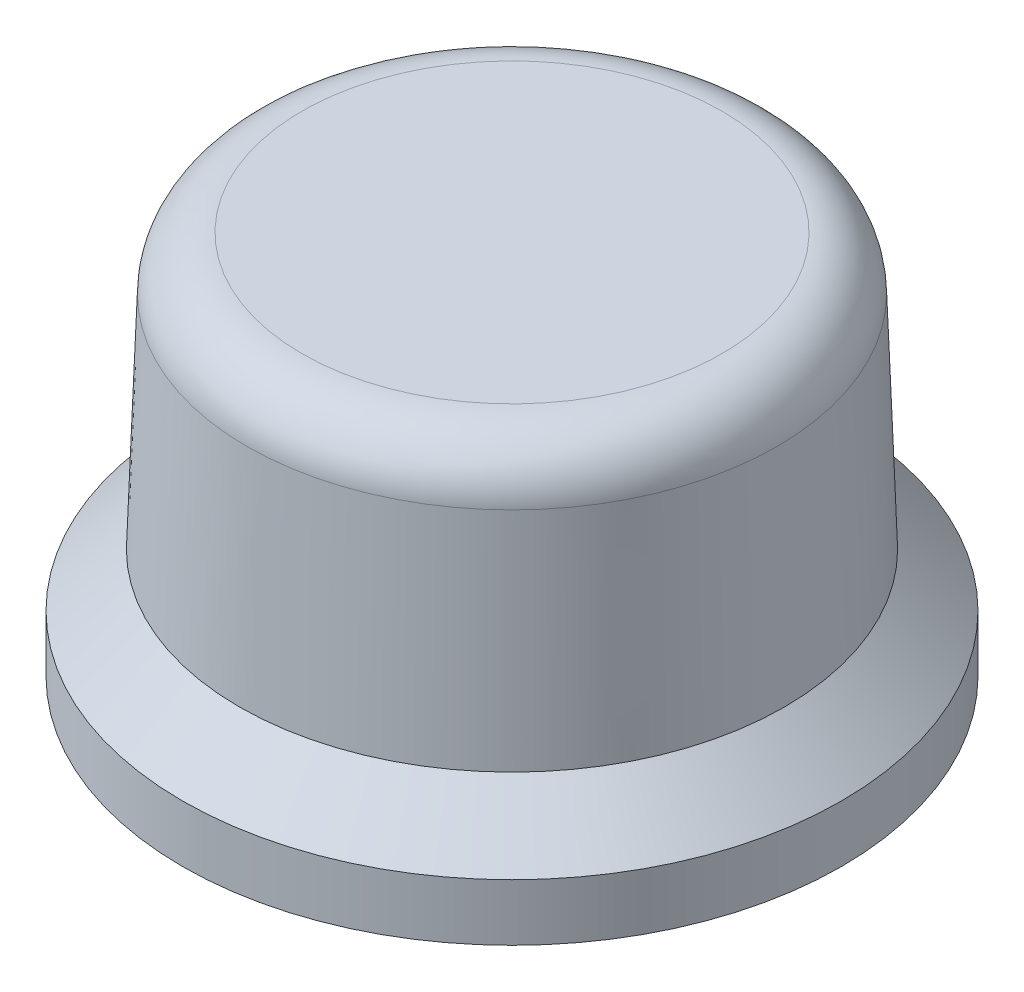
ISO-10303-21;
HEADER;
FILE_DESCRIPTION(('STEP AP214'),'2;1');
FILE_NAME('part.step','',(''),(''),'','','');
FILE_SCHEMA(('AUTOMOTIVE_DESIGN { 1 0 10303 214 1 1 1 1 }'));
ENDSEC;
DATA;
#1=APPLICATION_CONTEXT('core data for automotive mechanical design processes');
#2=APPLICATION_PROTOCOL_DEFINITION('international standard','automotive_design',2000,#1);
#3=PRODUCT_CONTEXT('',#1,'mechanical');
#4=PRODUCT('Part','Part','',(#3));
#5=PRODUCT_RELATED_PRODUCT_CATEGORY('part','',(#4));
#6=PRODUCT_DEFINITION_FORMATION('','',#4);
#7=PRODUCT_DEFINITION_CONTEXT('part definition',#1,'design');
#8=PRODUCT_DEFINITION('design','',#6,#7);
#9=PRODUCT_DEFINITION_SHAPE('','',#8);
#10=(LENGTH_UNIT() NAMED_UNIT(*) SI_UNIT(.MILLI.,.METRE.));
#11=(NAMED_UNIT(*) PLANE_ANGLE_UNIT() SI_UNIT($,.RADIAN.));
#12=(NAMED_UNIT(*) SI_UNIT($,.STERADIAN.) SOLID_ANGLE_UNIT());
#13=UNCERTAINTY_MEASURE_WITH_UNIT(LENGTH_MEASURE(1.E-05),#10,'distance_accuracy_value','');
#14=(GEOMETRIC_REPRESENTATION_CONTEXT(3) GLOBAL_UNCERTAINTY_ASSIGNED_CONTEXT((#13)) GLOBAL_UNIT_ASSIGNED_CONTEXT((#10,
#11,#12)) REPRESENTATION_CONTEXT('',''));
#15=CARTESIAN_POINT('',(0.,0.,0.));
#16=DIRECTION('',(0.,0.,1.));
#17=DIRECTION('',(1.,0.,0.));
#18=AXIS2_PLACEMENT_3D('',#15,#16,#17);
#19=CARTESIAN_POINT('',(0.,0.,0.));
#20=DIRECTION('',(0.,-1.,0.));
#21=DIRECTION('',(0.,0.,1.));
#22=AXIS2_PLACEMENT_3D('',#19,#20,#21);
#23=CONICAL_SURFACE('',#22,5.,0.0349065850398867);
#24=CARTESIAN_POINT('',(0.,0.999390827019102,0.));
#25=DIRECTION('',(0.,-1.,0.));
#26=DIRECTION('',(0.,0.,-1.));
#27=AXIS2_PLACEMENT_3D('',#24,#25,#26);
#28=CIRCLE('',#27,4.9651005032975);
#29=CARTESIAN_POINT('',(0.,0.999390827019102,-4.9651005032975));
#30=VERTEX_POINT('',#29);
#31=EDGE_CURVE('E42',#30,#30,#28,.F.);
#32=ORIENTED_EDGE('',*,*,#31,.T.);
#33=EDGE_LOOP('',(#32));
#34=FACE_BOUND('',#33,.T.);
#35=CARTESIAN_POINT('',(0.,5.0348994967025,0.));
#36=DIRECTION('',(0.,-1.,0.));
#37=DIRECTION('',(0.,0.,-1.));
#38=AXIS2_PLACEMENT_3D('',#35,#36,#37);
#39=CIRCLE('',#38,4.82417743526153);
#40=CARTESIAN_POINT('',(0.,5.0348994967025,-4.82417743526153));
#41=VERTEX_POINT('',#40);
#42=EDGE_CURVE('E71',#41,#41,#39,.T.);
#43=ORIENTED_EDGE('',*,*,#42,.T.);
#44=EDGE_LOOP('',(#43));
#45=FACE_BOUND('',#44,.T.);
#46=ADVANCED_FACE('F35',(#34,#45),#23,.T.);
#47=CARTESIAN_POINT('',(0.,6.,0.));
#48=DIRECTION('',(0.,1.,0.));
#49=DIRECTION('',(0.,0.,1.));
#50=AXIS2_PLACEMENT_3D('',#47,#48,#49);
#51=PLANE('',#50);
#52=CARTESIAN_POINT('',(0.,6.,0.));
#53=DIRECTION('',(0.,1.,0.));
#54=DIRECTION('',(0.,0.,1.));
#55=AXIS2_PLACEMENT_3D('',#52,#53,#54);
#56=CIRCLE('',#55,3.82478660824244);
#57=CARTESIAN_POINT('',(0.,6.,3.82478660824244));
#58=VERTEX_POINT('',#57);
#59=EDGE_CURVE('E74',#58,#58,#56,.T.);
#60=ORIENTED_EDGE('',*,*,#59,.T.);
#61=EDGE_LOOP('',(#60));
#62=FACE_BOUND('',#61,.T.);
#63=ADVANCED_FACE('F107',(#62),#51,.T.);
#64=CARTESIAN_POINT('',(0.,-1.,0.));
#65=DIRECTION('',(0.,1.,0.));
#66=DIRECTION('',(0.,0.,1.));
#67=AXIS2_PLACEMENT_3D('',#64,#65,#66);
#68=CYLINDRICAL_SURFACE('',#67,6.);
#69=CARTESIAN_POINT('',(0.,0.0343314337077569,0.));
#70=DIRECTION('',(0.,-1.,0.));
#71=DIRECTION('',(0.,0.,-1.));
#72=AXIS2_PLACEMENT_3D('',#69,#70,#71);
#73=CIRCLE('',#72,6.);
#74=CARTESIAN_POINT('',(0.,0.0343314337077569,-6.));
#75=VERTEX_POINT('',#74);
#76=EDGE_CURVE('E10',#75,#75,#73,.T.);
#77=ORIENTED_EDGE('',*,*,#76,.T.);
#78=EDGE_LOOP('',(#77));
#79=FACE_BOUND('',#78,.T.);
#80=CARTESIAN_POINT('',(0.,-1.,0.));
#81=DIRECTION('',(0.,-1.,0.));
#82=DIRECTION('',(0.,0.,-1.));
#83=AXIS2_PLACEMENT_3D('',#80,#81,#82);
#84=CIRCLE('',#83,6.);
#85=CARTESIAN_POINT('',(0.,-1.,-6.));
#86=VERTEX_POINT('',#85);
#87=EDGE_CURVE('E77',#86,#86,#84,.T.);
#88=ORIENTED_EDGE('',*,*,#87,.F.);
#89=EDGE_LOOP('',(#88));
#90=FACE_BOUND('',#89,.T.);
#91=ADVANCED_FACE('F112',(#79,#90),#68,.T.);
#92=CARTESIAN_POINT('',(0.,-1.,0.));
#93=DIRECTION('',(0.,-1.,0.));
#94=DIRECTION('',(0.,0.,-1.));
#95=AXIS2_PLACEMENT_3D('',#92,#93,#94);
#96=PLANE('',#95);
#97=CARTESIAN_POINT('',(0.,-1.,0.));
#98=DIRECTION('',(0.,-1.,0.));
#99=DIRECTION('',(0.,0.,-1.));
#100=AXIS2_PLACEMENT_3D('',#97,#98,#99);
#101=CIRCLE('',#100,2.75);
#102=CARTESIAN_POINT('',(0.,-1.,-2.75));
#103=VERTEX_POINT('',#102);
#104=EDGE_CURVE('E62',#103,#103,#101,.F.);
#105=ORIENTED_EDGE('',*,*,#104,.T.);
#106=EDGE_LOOP('',(#105));
#107=FACE_BOUND('',#106,.T.);
#108=ORIENTED_EDGE('',*,*,#87,.T.);
#109=EDGE_LOOP('',(#108));
#110=FACE_BOUND('',#109,.T.);
#111=ADVANCED_FACE('F102',(#107,#110),#96,.T.);
#112=CARTESIAN_POINT('',(0.,5.,0.));
#113=DIRECTION('',(0.,1.,0.));
#114=DIRECTION('',(0.,0.,1.));
#115=AXIS2_PLACEMENT_3D('',#112,#113,#114);
#116=TOROIDAL_SURFACE('',#115,3.82478660824244,1.);
#117=ORIENTED_EDGE('',*,*,#42,.F.);
#118=EDGE_LOOP('',(#117));
#119=FACE_BOUND('',#118,.T.);
#120=ORIENTED_EDGE('',*,*,#59,.F.);
#121=EDGE_LOOP('',(#120));
#122=FACE_BOUND('',#121,.T.);
#123=ADVANCED_FACE('F96',(#119,#122),#116,.T.);
#124=CARTESIAN_POINT('',(0.,0.,0.));
#125=DIRECTION('',(0.,-1.,0.));
#126=DIRECTION('',(0.,0.,-1.));
#127=AXIS2_PLACEMENT_3D('',#124,#125,#126);
#128=CYLINDRICAL_SURFACE('',#127,2.5);
#129=CARTESIAN_POINT('',(0.,-0.75,0.));
#130=DIRECTION('',(0.,-1.,0.));
#131=DIRECTION('',(0.,0.,-1.));
#132=AXIS2_PLACEMENT_3D('',#129,#130,#131);
#133=CIRCLE('',#132,2.5);
#134=CARTESIAN_POINT('',(0.,-0.75,-2.5));
#135=VERTEX_POINT('',#134);
#136=EDGE_CURVE('E65',#135,#135,#133,.T.);
#137=ORIENTED_EDGE('',*,*,#136,.T.);
#138=EDGE_LOOP('',(#137));
#139=FACE_BOUND('',#138,.T.);
#140=CARTESIAN_POINT('',(0.,0.,0.));
#141=DIRECTION('',(0.,-1.,0.));
#142=DIRECTION('',(0.,0.,-1.));
#143=AXIS2_PLACEMENT_3D('',#140,#141,#142);
#144=CIRCLE('',#143,2.5);
#145=CARTESIAN_POINT('',(0.,0.,-2.5));
#146=VERTEX_POINT('',#145);
#147=EDGE_CURVE('E80',#146,#146,#144,.T.);
#148=ORIENTED_EDGE('',*,*,#147,.F.);
#149=EDGE_LOOP('',(#148));
#150=FACE_BOUND('',#149,.T.);
#151=ADVANCED_FACE('F91',(#139,#150),#128,.F.);
#152=CARTESIAN_POINT('',(0.,0.,0.));
#153=DIRECTION('',(0.,-1.,0.));
#154=DIRECTION('',(0.,0.,-1.));
#155=AXIS2_PLACEMENT_3D('',#152,#153,#154);
#156=PLANE('',#155);
#157=CARTESIAN_POINT('',(0.,0.,0.));
#158=DIRECTION('',(0.,-1.,0.));
#159=DIRECTION('',(0.,0.,-1.));
#160=AXIS2_PLACEMENT_3D('',#157,#158,#159);
#161=CIRCLE('',#160,2.);
#162=CARTESIAN_POINT('',(0.,0.,-2.));
#163=VERTEX_POINT('',#162);
#164=EDGE_CURVE('E59',#163,#163,#161,.T.);
#165=ORIENTED_EDGE('',*,*,#164,.F.);
#166=EDGE_LOOP('',(#165));
#167=FACE_BOUND('',#166,.T.);
#168=ORIENTED_EDGE('',*,*,#147,.T.);
#169=EDGE_LOOP('',(#168));
#170=FACE_BOUND('',#169,.T.);
#171=ADVANCED_FACE('F88',(#167,#170),#156,.T.);
#172=CARTESIAN_POINT('',(0.,0.,0.));
#173=DIRECTION('',(0.,-1.,0.));
#174=DIRECTION('',(0.,0.,-1.));
#175=AXIS2_PLACEMENT_3D('',#172,#173,#174);
#176=CYLINDRICAL_SURFACE('',#175,2.);
#177=CARTESIAN_POINT('',(0.,-0.75,0.));
#178=DIRECTION('',(0.,-1.,0.));
#179=DIRECTION('',(0.,0.,-1.));
#180=AXIS2_PLACEMENT_3D('',#177,#178,#179);
#181=CIRCLE('',#180,2.);
#182=CARTESIAN_POINT('',(0.,-0.75,-2.));
#183=VERTEX_POINT('',#182);
#184=EDGE_CURVE('E55',#183,#183,#181,.F.);
#185=ORIENTED_EDGE('',*,*,#184,.T.);
#186=EDGE_LOOP('',(#185));
#187=FACE_BOUND('',#186,.T.);
#188=ORIENTED_EDGE('',*,*,#164,.T.);
#189=EDGE_LOOP('',(#188));
#190=FACE_BOUND('',#189,.T.);
#191=ADVANCED_FACE('F86',(#187,#190),#176,.T.);
#192=CARTESIAN_POINT('',(0.,-3.5,0.));
#193=DIRECTION('',(0.,1.,0.));
#194=DIRECTION('',(0.,0.,1.));
#195=AXIS2_PLACEMENT_3D('',#192,#193,#194);
#196=CYLINDRICAL_SURFACE('',#195,1.5);
#197=CARTESIAN_POINT('',(0.,-3.25,0.));
#198=DIRECTION('',(0.,-1.,0.));
#199=DIRECTION('',(0.,0.,-1.));
#200=AXIS2_PLACEMENT_3D('',#197,#198,#199);
#201=CIRCLE('',#200,1.5);
#202=CARTESIAN_POINT('',(0.,-3.25,-1.5));
#203=VERTEX_POINT('',#202);
#204=EDGE_CURVE('E46',#203,#203,#201,.F.);
#205=ORIENTED_EDGE('',*,*,#204,.T.);
#206=EDGE_LOOP('',(#205));
#207=FACE_BOUND('',#206,.T.);
#208=CARTESIAN_POINT('',(0.,-1.25,0.));
#209=DIRECTION('',(0.,-1.,0.));
#210=DIRECTION('',(0.,0.,-1.));
#211=AXIS2_PLACEMENT_3D('',#208,#209,#210);
#212=CIRCLE('',#211,1.5);
#213=CARTESIAN_POINT('',(0.,-1.25,-1.5));
#214=VERTEX_POINT('',#213);
#215=EDGE_CURVE('E68',#214,#214,#212,.T.);
#216=ORIENTED_EDGE('',*,*,#215,.T.);
#217=EDGE_LOOP('',(#216));
#218=FACE_BOUND('',#217,.T.);
#219=ADVANCED_FACE('F142',(#207,#218),#196,.T.);
#220=CARTESIAN_POINT('',(0.,-3.5,0.));
#221=DIRECTION('',(0.,-1.,0.));
#222=DIRECTION('',(0.,0.,-1.));
#223=AXIS2_PLACEMENT_3D('',#220,#221,#222);
#224=PLANE('',#223);
#225=CARTESIAN_POINT('',(0.,-3.5,0.));
#226=DIRECTION('',(0.,-1.,0.));
#227=DIRECTION('',(0.,0.,-1.));
#228=AXIS2_PLACEMENT_3D('',#225,#226,#227);
#229=CIRCLE('',#228,1.25);
#230=CARTESIAN_POINT('',(0.,-3.5,-1.25));
#231=VERTEX_POINT('',#230);
#232=EDGE_CURVE('E50',#231,#231,#229,.T.);
#233=ORIENTED_EDGE('',*,*,#232,.T.);
#234=EDGE_LOOP('',(#233));
#235=FACE_BOUND('',#234,.T.);
#236=ADVANCED_FACE('F126',(#235),#224,.T.);
#237=CARTESIAN_POINT('',(0.,-0.75,0.));
#238=DIRECTION('',(0.,-1.,0.));
#239=DIRECTION('',(0.,0.,-1.));
#240=AXIS2_PLACEMENT_3D('',#237,#238,#239);
#241=TOROIDAL_SURFACE('',#240,1.75,0.25);
#242=ORIENTED_EDGE('',*,*,#184,.F.);
#243=EDGE_LOOP('',(#242));
#244=FACE_BOUND('',#243,.T.);
#245=CARTESIAN_POINT('',(0.,-1.,0.));
#246=DIRECTION('',(0.,-1.,0.));
#247=DIRECTION('',(0.,0.,-1.));
#248=AXIS2_PLACEMENT_3D('',#245,#246,#247);
#249=CIRCLE('',#248,1.75);
#250=CARTESIAN_POINT('',(0.,-1.,-1.75));
#251=VERTEX_POINT('',#250);
#252=EDGE_CURVE('E56',#251,#251,#249,.T.);
#253=ORIENTED_EDGE('',*,*,#252,.F.);
#254=EDGE_LOOP('',(#253));
#255=FACE_BOUND('',#254,.T.);
#256=ADVANCED_FACE('F122',(#244,#255),#241,.T.);
#257=CARTESIAN_POINT('',(0.,-1.25,0.));
#258=DIRECTION('',(0.,-1.,0.));
#259=DIRECTION('',(0.,0.,-1.));
#260=AXIS2_PLACEMENT_3D('',#257,#258,#259);
#261=TOROIDAL_SURFACE('',#260,1.75,0.25);
#262=ORIENTED_EDGE('',*,*,#252,.T.);
#263=EDGE_LOOP('',(#262));
#264=FACE_BOUND('',#263,.T.);
#265=ORIENTED_EDGE('',*,*,#215,.F.);
#266=EDGE_LOOP('',(#265));
#267=FACE_BOUND('',#266,.T.);
#268=ADVANCED_FACE('F118',(#264,#267),#261,.F.);
#269=CARTESIAN_POINT('',(0.,-0.75,0.));
#270=DIRECTION('',(0.,-1.,0.));
#271=DIRECTION('',(0.,0.,-1.));
#272=AXIS2_PLACEMENT_3D('',#269,#270,#271);
#273=TOROIDAL_SURFACE('',#272,2.75,0.25);
#274=ORIENTED_EDGE('',*,*,#104,.F.);
#275=EDGE_LOOP('',(#274));
#276=FACE_BOUND('',#275,.T.);
#277=ORIENTED_EDGE('',*,*,#136,.F.);
#278=EDGE_LOOP('',(#277));
#279=FACE_BOUND('',#278,.T.);
#280=ADVANCED_FACE('F121',(#276,#279),#273,.T.);
#281=CARTESIAN_POINT('',(0.,-3.25,0.));
#282=DIRECTION('',(0.,-1.,0.));
#283=DIRECTION('',(0.,0.,-1.));
#284=AXIS2_PLACEMENT_3D('',#281,#282,#283);
#285=TOROIDAL_SURFACE('',#284,1.25,0.25);
#286=ORIENTED_EDGE('',*,*,#204,.F.);
#287=EDGE_LOOP('',(#286));
#288=FACE_BOUND('',#287,.T.);
#289=ORIENTED_EDGE('',*,*,#232,.F.);
#290=EDGE_LOOP('',(#289));
#291=FACE_BOUND('',#290,.T.);
#292=ADVANCED_FACE('F129',(#288,#291),#285,.T.);
#293=CARTESIAN_POINT('',(0.,0.,0.));
#294=DIRECTION('',(0.,-1.,0.));
#295=DIRECTION('',(0.,0.,-1.));
#296=AXIS2_PLACEMENT_3D('',#293,#294,#295);
#297=CONICAL_SURFACE('',#296,6.03681595527849,0.820304748437341);
#298=ORIENTED_EDGE('',*,*,#31,.F.);
#299=EDGE_LOOP('',(#298));
#300=FACE_BOUND('',#299,.T.);
#301=ORIENTED_EDGE('',*,*,#76,.F.);
#302=EDGE_LOOP('',(#301));
#303=FACE_BOUND('',#302,.T.);
#304=ADVANCED_FACE('F37',(#300,#303),#297,.T.);
#305=CLOSED_SHELL('',(#46,#63,#91,#111,#123,#151,#171,#191,#219,#236,#256,#268,#280,#292,#304));
#306=MANIFOLD_SOLID_BREP('B2',#305);
#307=ADVANCED_BREP_SHAPE_REPRESENTATION('',(#18,#306),#14);
#308=SHAPE_DEFINITION_REPRESENTATION(#9,#307);
ENDSEC;
END-ISO-10303-21;
